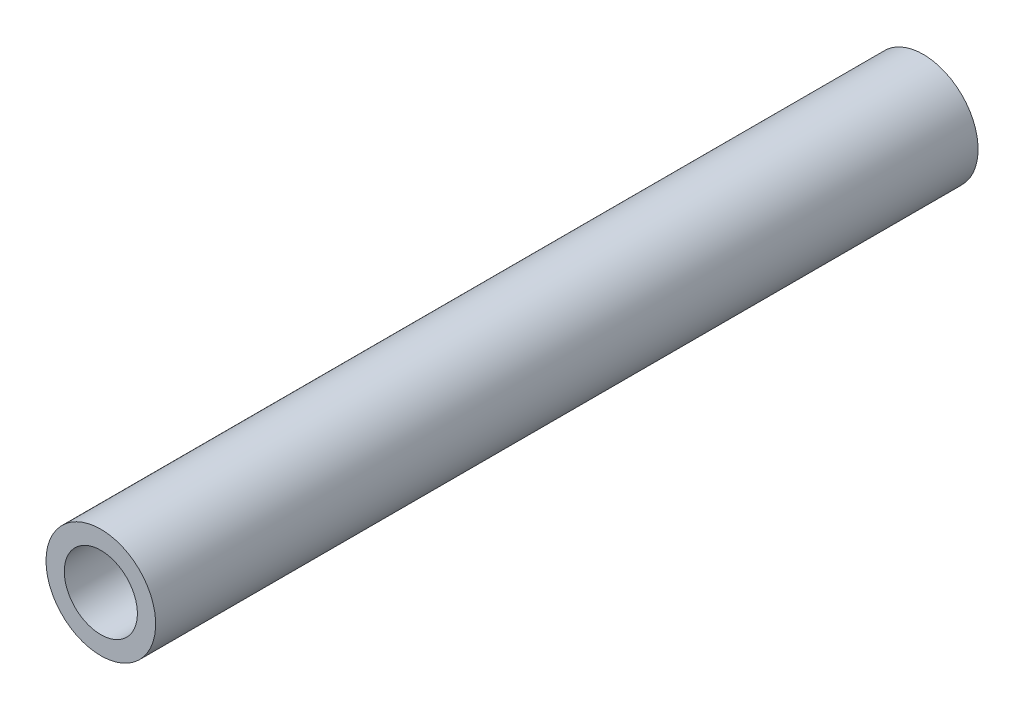
ISO-10303-21;
HEADER;
FILE_DESCRIPTION(('STEP AP214'),'2;1');
FILE_NAME('part.step','',(''),(''),'','','');
FILE_SCHEMA(('AUTOMOTIVE_DESIGN { 1 0 10303 214 1 1 1 1 }'));
ENDSEC;
DATA;
#1=APPLICATION_CONTEXT('core data for automotive mechanical design processes');
#2=APPLICATION_PROTOCOL_DEFINITION('international standard','automotive_design',2000,#1);
#3=PRODUCT_CONTEXT('',#1,'mechanical');
#4=PRODUCT('Part','Part','',(#3));
#5=PRODUCT_RELATED_PRODUCT_CATEGORY('part','',(#4));
#6=PRODUCT_DEFINITION_FORMATION('','',#4);
#7=PRODUCT_DEFINITION_CONTEXT('part definition',#1,'design');
#8=PRODUCT_DEFINITION('design','',#6,#7);
#9=PRODUCT_DEFINITION_SHAPE('','',#8);
#10=(LENGTH_UNIT() NAMED_UNIT(*) SI_UNIT(.MILLI.,.METRE.));
#11=(NAMED_UNIT(*) PLANE_ANGLE_UNIT() SI_UNIT($,.RADIAN.));
#12=(NAMED_UNIT(*) SI_UNIT($,.STERADIAN.) SOLID_ANGLE_UNIT());
#13=UNCERTAINTY_MEASURE_WITH_UNIT(LENGTH_MEASURE(1.E-05),#10,'distance_accuracy_value','');
#14=(GEOMETRIC_REPRESENTATION_CONTEXT(3) GLOBAL_UNCERTAINTY_ASSIGNED_CONTEXT((#13)) GLOBAL_UNIT_ASSIGNED_CONTEXT((#10,
#11,#12)) REPRESENTATION_CONTEXT('',''));
#15=CARTESIAN_POINT('',(0.,0.,0.));
#16=DIRECTION('',(0.,0.,1.));
#17=DIRECTION('',(1.,0.,0.));
#18=AXIS2_PLACEMENT_3D('',#15,#16,#17);
#19=CARTESIAN_POINT('',(75.,-87.5,53.4852813742386));
#20=DIRECTION('',(0.,0.,-1.));
#21=DIRECTION('',(-1.,0.,0.));
#22=AXIS2_PLACEMENT_3D('',#19,#20,#21);
#23=CYLINDRICAL_SURFACE('',#22,3.00000000000001);
#24=CARTESIAN_POINT('',(75.,-87.5,0.));
#25=DIRECTION('',(0.,0.,1.));
#26=DIRECTION('',(1.,0.,0.));
#27=AXIS2_PLACEMENT_3D('',#24,#25,#26);
#28=CIRCLE('',#27,3.00000000000001);
#29=CARTESIAN_POINT('',(72.,-87.5,0.));
#30=VERTEX_POINT('',#29);
#31=EDGE_CURVE('E46',#30,#30,#28,.T.);
#32=CARTESIAN_POINT('',(75.,-87.5,45.));
#33=DIRECTION('',(0.,0.,1.));
#34=DIRECTION('',(1.,0.,0.));
#35=AXIS2_PLACEMENT_3D('',#32,#33,#34);
#36=CIRCLE('',#35,3.00000000000001);
#37=CARTESIAN_POINT('',(72.,-87.5,45.));
#38=VERTEX_POINT('',#37);
#39=EDGE_CURVE('E10',#38,#38,#36,.T.);
#40=CARTESIAN_POINT('',(72.,-87.5,0.));
#41=CARTESIAN_POINT('',(72.,-87.5,0.468749999999993));
#42=CARTESIAN_POINT('',(72.,-87.5,0.937499999999992));
#43=CARTESIAN_POINT('',(72.,-87.5,1.87499999999999));
#44=CARTESIAN_POINT('',(72.,-87.5,2.34374999999999));
#45=CARTESIAN_POINT('',(72.,-87.5,3.28124999999999));
#46=CARTESIAN_POINT('',(72.,-87.5,3.74999999999999));
#47=CARTESIAN_POINT('',(72.,-87.5,4.68749999999999));
#48=CARTESIAN_POINT('',(72.,-87.5,5.15624999999999));
#49=CARTESIAN_POINT('',(72.,-87.5,6.09374999999999));
#50=CARTESIAN_POINT('',(72.,-87.5,6.56249999999999));
#51=CARTESIAN_POINT('',(72.,-87.5,7.5));
#52=CARTESIAN_POINT('',(72.,-87.5,7.96874999999999));
#53=CARTESIAN_POINT('',(72.,-87.5,8.90624999999999));
#54=CARTESIAN_POINT('',(72.,-87.5,9.37499999999999));
#55=CARTESIAN_POINT('',(72.,-87.5,10.3125));
#56=CARTESIAN_POINT('',(72.,-87.5,10.78125));
#57=CARTESIAN_POINT('',(72.,-87.5,11.71875));
#58=CARTESIAN_POINT('',(72.,-87.5,12.1875));
#59=CARTESIAN_POINT('',(72.,-87.5,13.125));
#60=CARTESIAN_POINT('',(72.,-87.5,13.59375));
#61=CARTESIAN_POINT('',(72.,-87.5,14.53125));
#62=CARTESIAN_POINT('',(72.,-87.5,15.));
#63=CARTESIAN_POINT('',(72.,-87.5,15.9375));
#64=CARTESIAN_POINT('',(72.,-87.5,16.40625));
#65=CARTESIAN_POINT('',(72.,-87.5,17.34375));
#66=CARTESIAN_POINT('',(72.,-87.5,17.8125));
#67=CARTESIAN_POINT('',(72.,-87.5,18.75));
#68=CARTESIAN_POINT('',(72.,-87.5,19.21875));
#69=CARTESIAN_POINT('',(72.,-87.5,20.15625));
#70=CARTESIAN_POINT('',(72.,-87.5,20.625));
#71=CARTESIAN_POINT('',(72.,-87.5,21.5625));
#72=CARTESIAN_POINT('',(72.,-87.5,22.03125));
#73=CARTESIAN_POINT('',(72.,-87.5,22.96875));
#74=CARTESIAN_POINT('',(72.,-87.5,23.4375));
#75=CARTESIAN_POINT('',(72.,-87.5,24.375));
#76=CARTESIAN_POINT('',(72.,-87.5,24.84375));
#77=CARTESIAN_POINT('',(72.,-87.5,25.78125));
#78=CARTESIAN_POINT('',(72.,-87.5,26.25));
#79=CARTESIAN_POINT('',(72.,-87.5,27.1875));
#80=CARTESIAN_POINT('',(72.,-87.5,27.65625));
#81=CARTESIAN_POINT('',(72.,-87.5,28.59375));
#82=CARTESIAN_POINT('',(72.,-87.5,29.0625));
#83=CARTESIAN_POINT('',(72.,-87.5,30.));
#84=CARTESIAN_POINT('',(72.,-87.5,30.46875));
#85=CARTESIAN_POINT('',(72.,-87.5,31.40625));
#86=CARTESIAN_POINT('',(72.,-87.5,31.875));
#87=CARTESIAN_POINT('',(72.,-87.5,32.8125));
#88=CARTESIAN_POINT('',(72.,-87.5,33.28125));
#89=CARTESIAN_POINT('',(72.,-87.5,34.21875));
#90=CARTESIAN_POINT('',(72.,-87.5,34.6875));
#91=CARTESIAN_POINT('',(72.,-87.5,35.625));
#92=CARTESIAN_POINT('',(72.,-87.5,36.09375));
#93=CARTESIAN_POINT('',(72.,-87.5,37.03125));
#94=CARTESIAN_POINT('',(72.,-87.5,37.5));
#95=CARTESIAN_POINT('',(72.,-87.5,38.4375));
#96=CARTESIAN_POINT('',(72.,-87.5,38.90625));
#97=CARTESIAN_POINT('',(72.,-87.5,39.84375));
#98=CARTESIAN_POINT('',(72.,-87.5,40.3125));
#99=CARTESIAN_POINT('',(72.,-87.5,41.25));
#100=CARTESIAN_POINT('',(72.,-87.5,41.71875));
#101=CARTESIAN_POINT('',(72.,-87.5,42.65625));
#102=CARTESIAN_POINT('',(72.,-87.5,43.125));
#103=CARTESIAN_POINT('',(72.,-87.5,44.0625));
#104=CARTESIAN_POINT('',(72.,-87.5,44.53125));
#105=CARTESIAN_POINT('',(72.,-87.5,45.));
#106=B_SPLINE_CURVE_WITH_KNOTS('',3,(#40,#41,#42,#43,#44,#45,#46,#47,#48,#49,#50,#51,#52,#53,
#54,#55,#56,#57,#58,#59,#60,#61,#62,#63,#64,#65,#66,#67,#68,#69,#70,#71,#72,#73,#74,#75,#76,#77,
#78,#79,#80,#81,#82,#83,#84,#85,#86,#87,#88,#89,#90,#91,#92,#93,#94,#95,#96,#97,#98,#99,#100,
#101,#102,#103,#104,#105),.UNSPECIFIED.,.F.,.F.,(4,2,2,2,2,2,2,2,2,2,2,2,2,2,2,2,2,2,2,2,2,2,2,
2,2,2,2,2,2,2,2,2,4),(0.,1.40625,2.8125,4.21875,5.625,7.03125,8.4375,9.84375,11.25,12.65625,
14.0625,15.46875,16.875,18.28125,19.6875,21.09375,22.5,23.90625,25.3125,26.71875,28.125,
29.53125,30.9375,32.34375,33.75,35.15625,36.5625,37.96875,39.375,40.78125,42.1875,43.59375,45.),.UNSPECIFIED.);
#107=EDGE_CURVE('BSEAM35',#30,#38,#106,.T.);
#108=ORIENTED_EDGE('',*,*,#31,.T.);
#109=ORIENTED_EDGE('',*,*,#39,.F.);
#110=ORIENTED_EDGE('',*,*,#107,.T.);
#111=ORIENTED_EDGE('',*,*,#107,.F.);
#112=EDGE_LOOP('',(#108,#110,#109,#111));
#113=FACE_BOUND('',#112,.T.);
#114=ADVANCED_FACE('F35',(#113),#23,.T.);
#115=CARTESIAN_POINT('',(75.,-87.5,0.));
#116=DIRECTION('',(0.,0.,1.));
#117=DIRECTION('',(1.,0.,0.));
#118=AXIS2_PLACEMENT_3D('',#115,#116,#117);
#119=PLANE('',#118);
#120=ORIENTED_EDGE('',*,*,#31,.F.);
#121=EDGE_LOOP('',(#120));
#122=FACE_BOUND('',#121,.T.);
#123=CARTESIAN_POINT('',(75.,-87.5,0.));
#124=DIRECTION('',(0.,0.,1.));
#125=DIRECTION('',(1.,0.,0.));
#126=AXIS2_PLACEMENT_3D('',#123,#124,#125);
#127=CIRCLE('',#126,2.);
#128=CARTESIAN_POINT('',(73.,-87.5,0.));
#129=VERTEX_POINT('',#128);
#130=EDGE_CURVE('E48',#129,#129,#127,.T.);
#131=ORIENTED_EDGE('',*,*,#130,.T.);
#132=EDGE_LOOP('',(#131));
#133=FACE_BOUND('',#132,.T.);
#134=ADVANCED_FACE('F57',(#122,#133),#119,.F.);
#135=CARTESIAN_POINT('',(75.,-87.5,53.4852813742386));
#136=DIRECTION('',(0.,0.,-1.));
#137=DIRECTION('',(-1.,0.,0.));
#138=AXIS2_PLACEMENT_3D('',#135,#136,#137);
#139=CYLINDRICAL_SURFACE('',#138,2.);
#140=CARTESIAN_POINT('',(75.,-87.5,45.));
#141=DIRECTION('',(0.,0.,1.));
#142=DIRECTION('',(1.,0.,0.));
#143=AXIS2_PLACEMENT_3D('',#140,#141,#142);
#144=CIRCLE('',#143,2.);
#145=CARTESIAN_POINT('',(73.,-87.5,45.));
#146=VERTEX_POINT('',#145);
#147=EDGE_CURVE('E38',#146,#146,#144,.T.);
#148=CARTESIAN_POINT('',(73.,-87.5,0.));
#149=CARTESIAN_POINT('',(73.,-87.5,0.468749999999993));
#150=CARTESIAN_POINT('',(73.,-87.5,0.937499999999992));
#151=CARTESIAN_POINT('',(73.,-87.5,1.87499999999999));
#152=CARTESIAN_POINT('',(73.,-87.5,2.34374999999999));
#153=CARTESIAN_POINT('',(73.,-87.5,3.28124999999999));
#154=CARTESIAN_POINT('',(73.,-87.5,3.74999999999999));
#155=CARTESIAN_POINT('',(73.,-87.5,4.68749999999999));
#156=CARTESIAN_POINT('',(73.,-87.5,5.15624999999999));
#157=CARTESIAN_POINT('',(73.,-87.5,6.09374999999999));
#158=CARTESIAN_POINT('',(73.,-87.5,6.56249999999999));
#159=CARTESIAN_POINT('',(73.,-87.5,7.5));
#160=CARTESIAN_POINT('',(73.,-87.5,7.96874999999999));
#161=CARTESIAN_POINT('',(73.,-87.5,8.90624999999999));
#162=CARTESIAN_POINT('',(73.,-87.5,9.37499999999999));
#163=CARTESIAN_POINT('',(73.,-87.5,10.3125));
#164=CARTESIAN_POINT('',(73.,-87.5,10.78125));
#165=CARTESIAN_POINT('',(73.,-87.5,11.71875));
#166=CARTESIAN_POINT('',(73.,-87.5,12.1875));
#167=CARTESIAN_POINT('',(73.,-87.5,13.125));
#168=CARTESIAN_POINT('',(73.,-87.5,13.59375));
#169=CARTESIAN_POINT('',(73.,-87.5,14.53125));
#170=CARTESIAN_POINT('',(73.,-87.5,15.));
#171=CARTESIAN_POINT('',(73.,-87.5,15.9375));
#172=CARTESIAN_POINT('',(73.,-87.5,16.40625));
#173=CARTESIAN_POINT('',(73.,-87.5,17.34375));
#174=CARTESIAN_POINT('',(73.,-87.5,17.8125));
#175=CARTESIAN_POINT('',(73.,-87.5,18.75));
#176=CARTESIAN_POINT('',(73.,-87.5,19.21875));
#177=CARTESIAN_POINT('',(73.,-87.5,20.15625));
#178=CARTESIAN_POINT('',(73.,-87.5,20.625));
#179=CARTESIAN_POINT('',(73.,-87.5,21.5625));
#180=CARTESIAN_POINT('',(73.,-87.5,22.03125));
#181=CARTESIAN_POINT('',(73.,-87.5,22.96875));
#182=CARTESIAN_POINT('',(73.,-87.5,23.4375));
#183=CARTESIAN_POINT('',(73.,-87.5,24.375));
#184=CARTESIAN_POINT('',(73.,-87.5,24.84375));
#185=CARTESIAN_POINT('',(73.,-87.5,25.78125));
#186=CARTESIAN_POINT('',(73.,-87.5,26.25));
#187=CARTESIAN_POINT('',(73.,-87.5,27.1875));
#188=CARTESIAN_POINT('',(73.,-87.5,27.65625));
#189=CARTESIAN_POINT('',(73.,-87.5,28.59375));
#190=CARTESIAN_POINT('',(73.,-87.5,29.0625));
#191=CARTESIAN_POINT('',(73.,-87.5,30.));
#192=CARTESIAN_POINT('',(73.,-87.5,30.46875));
#193=CARTESIAN_POINT('',(73.,-87.5,31.40625));
#194=CARTESIAN_POINT('',(73.,-87.5,31.875));
#195=CARTESIAN_POINT('',(73.,-87.5,32.8125));
#196=CARTESIAN_POINT('',(73.,-87.5,33.28125));
#197=CARTESIAN_POINT('',(73.,-87.5,34.21875));
#198=CARTESIAN_POINT('',(73.,-87.5,34.6875));
#199=CARTESIAN_POINT('',(73.,-87.5,35.625));
#200=CARTESIAN_POINT('',(73.,-87.5,36.09375));
#201=CARTESIAN_POINT('',(73.,-87.5,37.03125));
#202=CARTESIAN_POINT('',(73.,-87.5,37.5));
#203=CARTESIAN_POINT('',(73.,-87.5,38.4375));
#204=CARTESIAN_POINT('',(73.,-87.5,38.90625));
#205=CARTESIAN_POINT('',(73.,-87.5,39.84375));
#206=CARTESIAN_POINT('',(73.,-87.5,40.3125));
#207=CARTESIAN_POINT('',(73.,-87.5,41.25));
#208=CARTESIAN_POINT('',(73.,-87.5,41.71875));
#209=CARTESIAN_POINT('',(73.,-87.5,42.65625));
#210=CARTESIAN_POINT('',(73.,-87.5,43.125));
#211=CARTESIAN_POINT('',(73.,-87.5,44.0625));
#212=CARTESIAN_POINT('',(73.,-87.5,44.53125));
#213=CARTESIAN_POINT('',(73.,-87.5,45.));
#214=B_SPLINE_CURVE_WITH_KNOTS('',3,(#148,#149,#150,#151,#152,#153,#154,#155,#156,#157,#158,
#159,#160,#161,#162,#163,#164,#165,#166,#167,#168,#169,#170,#171,#172,#173,#174,#175,#176,#177,
#178,#179,#180,#181,#182,#183,#184,#185,#186,#187,#188,#189,#190,#191,#192,#193,#194,#195,#196,
#197,#198,#199,#200,#201,#202,#203,#204,#205,#206,#207,#208,#209,#210,#211,#212,#213),
.UNSPECIFIED.,.F.,.F.,(4,2,2,2,2,2,2,2,2,2,2,2,2,2,2,2,2,2,2,2,2,2,2,2,2,2,2,2,2,2,2,2,4),(0.,
1.40625,2.8125,4.21875,5.625,7.03125,8.4375,9.84375,11.25,12.65625,14.0625,15.46875,16.875,
18.28125,19.6875,21.09375,22.5,23.90625,25.3125,26.71875,28.125,29.53125,30.9375,32.34375,33.75,
35.15625,36.5625,37.96875,39.375,40.78125,42.1875,43.59375,45.),.UNSPECIFIED.);
#215=EDGE_CURVE('BSEAM60',#129,#146,#214,.T.);
#216=ORIENTED_EDGE('',*,*,#130,.F.);
#217=ORIENTED_EDGE('',*,*,#147,.T.);
#218=ORIENTED_EDGE('',*,*,#215,.T.);
#219=ORIENTED_EDGE('',*,*,#215,.F.);
#220=EDGE_LOOP('',(#216,#218,#217,#219));
#221=FACE_BOUND('',#220,.T.);
#222=ADVANCED_FACE('F60',(#221),#139,.F.);
#223=CARTESIAN_POINT('',(0.,0.,45.));
#224=DIRECTION('',(0.,0.,1.));
#225=DIRECTION('',(0.,-1.,0.));
#226=AXIS2_PLACEMENT_3D('',#223,#224,#225);
#227=PLANE('',#226);
#228=ORIENTED_EDGE('',*,*,#147,.F.);
#229=EDGE_LOOP('',(#228));
#230=FACE_BOUND('',#229,.T.);
#231=ORIENTED_EDGE('',*,*,#39,.T.);
#232=EDGE_LOOP('',(#231));
#233=FACE_BOUND('',#232,.T.);
#234=ADVANCED_FACE('F65',(#230,#233),#227,.T.);
#235=CLOSED_SHELL('',(#114,#134,#222,#234));
#236=MANIFOLD_SOLID_BREP('B2',#235);
#237=ADVANCED_BREP_SHAPE_REPRESENTATION('',(#18,#236),#14);
#238=SHAPE_DEFINITION_REPRESENTATION(#9,#237);
ENDSEC;
END-ISO-10303-21;
